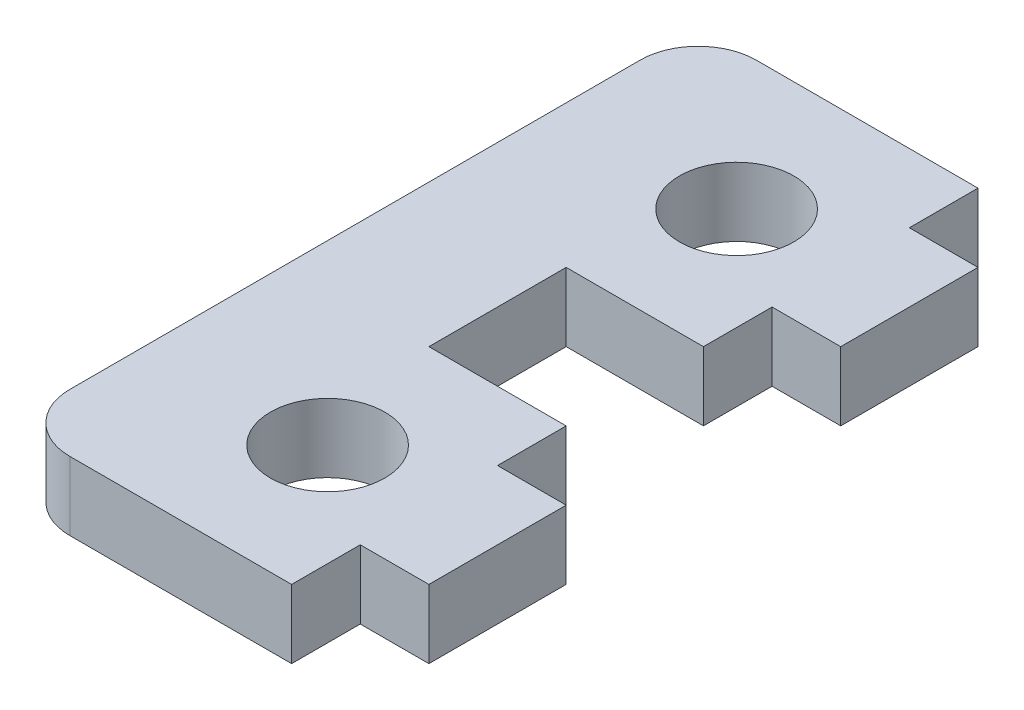
ISO-10303-21;
HEADER;
FILE_DESCRIPTION(('STEP AP214'),'2;1');
FILE_NAME('part.step','',(''),(''),'','','');
FILE_SCHEMA(('AUTOMOTIVE_DESIGN { 1 0 10303 214 1 1 1 1 }'));
ENDSEC;
DATA;
#1=APPLICATION_CONTEXT('core data for automotive mechanical design processes');
#2=APPLICATION_PROTOCOL_DEFINITION('international standard','automotive_design',2000,#1);
#3=PRODUCT_CONTEXT('',#1,'mechanical');
#4=PRODUCT('Part','Part','',(#3));
#5=PRODUCT_RELATED_PRODUCT_CATEGORY('part','',(#4));
#6=PRODUCT_DEFINITION_FORMATION('','',#4);
#7=PRODUCT_DEFINITION_CONTEXT('part definition',#1,'design');
#8=PRODUCT_DEFINITION('design','',#6,#7);
#9=PRODUCT_DEFINITION_SHAPE('','',#8);
#10=(LENGTH_UNIT() NAMED_UNIT(*) SI_UNIT(.MILLI.,.METRE.));
#11=(NAMED_UNIT(*) PLANE_ANGLE_UNIT() SI_UNIT($,.RADIAN.));
#12=(NAMED_UNIT(*) SI_UNIT($,.STERADIAN.) SOLID_ANGLE_UNIT());
#13=UNCERTAINTY_MEASURE_WITH_UNIT(LENGTH_MEASURE(1.E-05),#10,'distance_accuracy_value','');
#14=(GEOMETRIC_REPRESENTATION_CONTEXT(3) GLOBAL_UNCERTAINTY_ASSIGNED_CONTEXT((#13)) GLOBAL_UNIT_ASSIGNED_CONTEXT((#10,
#11,#12)) REPRESENTATION_CONTEXT('',''));
#15=CARTESIAN_POINT('',(0.,0.,0.));
#16=DIRECTION('',(0.,0.,1.));
#17=DIRECTION('',(1.,0.,0.));
#18=AXIS2_PLACEMENT_3D('',#15,#16,#17);
#19=CARTESIAN_POINT('',(-16.0467223141423,6.,30.92));
#20=DIRECTION('',(0.,-1.,0.));
#21=DIRECTION('',(0.,0.,-1.));
#22=AXIS2_PLACEMENT_3D('',#19,#20,#21);
#23=PLANE('',#22);
#24=CARTESIAN_POINT('',(-5.64372266443236,6.,-11.877299035422));
#25=DIRECTION('',(0.,1.,0.));
#26=DIRECTION('',(0.,0.,1.));
#27=AXIS2_PLACEMENT_3D('',#24,#25,#26);
#28=CIRCLE('',#27,5.);
#29=CARTESIAN_POINT('',(-5.64372266443236,6.,-6.87729903542202));
#30=VERTEX_POINT('',#29);
#31=EDGE_CURVE('E196',#30,#30,#28,.T.);
#32=ORIENTED_EDGE('',*,*,#31,.F.);
#33=EDGE_LOOP('',(#32));
#34=FACE_BOUND('',#33,.T.);
#35=DIRECTION('',(-1.,0.,0.));
#36=VECTOR('',#35,1.);
#37=CARTESIAN_POINT('',(-8.66777698518342,6.,12.));
#38=LINE('',#37,#36);
#39=CARTESIAN_POINT('',(3.33222301481658,6.,12.));
#40=VERTEX_POINT('',#39);
#41=CARTESIAN_POINT('',(-8.66777698518342,6.,12.));
#42=VERTEX_POINT('',#41);
#43=EDGE_CURVE('E227',#40,#42,#38,.T.);
#44=ORIENTED_EDGE('',*,*,#43,.T.);
#45=DIRECTION('',(0.,0.,-1.));
#46=VECTOR('',#45,1.);
#47=CARTESIAN_POINT('',(-8.66777698518343,6.,0.));
#48=LINE('',#47,#46);
#49=CARTESIAN_POINT('',(-8.66777698518343,6.,0.));
#50=VERTEX_POINT('',#49);
#51=EDGE_CURVE('E125',#42,#50,#48,.T.);
#52=ORIENTED_EDGE('',*,*,#51,.T.);
#53=DIRECTION('',(1.,0.,0.));
#54=VECTOR('',#53,1.);
#55=CARTESIAN_POINT('',(3.33222301481657,6.,0.));
#56=LINE('',#55,#54);
#57=CARTESIAN_POINT('',(3.33222301481657,6.,0.));
#58=VERTEX_POINT('',#57);
#59=EDGE_CURVE('E272',#50,#58,#56,.T.);
#60=ORIENTED_EDGE('',*,*,#59,.T.);
#61=DIRECTION('',(0.,0.,-1.));
#62=VECTOR('',#61,1.);
#63=CARTESIAN_POINT('',(3.33222301481657,6.,-6.00000000000007));
#64=LINE('',#63,#62);
#65=CARTESIAN_POINT('',(3.33222301481657,6.,-6.00000000000007));
#66=VERTEX_POINT('',#65);
#67=EDGE_CURVE('E291',#58,#66,#64,.T.);
#68=ORIENTED_EDGE('',*,*,#67,.T.);
#69=DIRECTION('',(1.,0.,0.));
#70=VECTOR('',#69,1.);
#71=CARTESIAN_POINT('',(9.33222301481657,6.,-6.00000000000008));
#72=LINE('',#71,#70);
#73=CARTESIAN_POINT('',(9.33222301481657,6.,-6.00000000000008));
#74=VERTEX_POINT('',#73);
#75=EDGE_CURVE('E288',#66,#74,#72,.T.);
#76=ORIENTED_EDGE('',*,*,#75,.T.);
#77=DIRECTION('',(0.,0.,-1.));
#78=VECTOR('',#77,1.);
#79=CARTESIAN_POINT('',(9.33222301481657,6.,-18.0000000000001));
#80=LINE('',#79,#78);
#81=CARTESIAN_POINT('',(9.33222301481657,6.,-18.0000000000001));
#82=VERTEX_POINT('',#81);
#83=EDGE_CURVE('E290',#74,#82,#80,.T.);
#84=ORIENTED_EDGE('',*,*,#83,.T.);
#85=DIRECTION('',(-1.,0.,0.));
#86=VECTOR('',#85,1.);
#87=CARTESIAN_POINT('',(3.33222301481658,6.,-18.));
#88=LINE('',#87,#86);
#89=CARTESIAN_POINT('',(3.33222301481658,6.,-18.));
#90=VERTEX_POINT('',#89);
#91=EDGE_CURVE('E293',#82,#90,#88,.T.);
#92=ORIENTED_EDGE('',*,*,#91,.T.);
#93=DIRECTION('',(0.,0.,-1.));
#94=VECTOR('',#93,1.);
#95=CARTESIAN_POINT('',(3.33222301481658,6.,-24.));
#96=LINE('',#95,#94);
#97=CARTESIAN_POINT('',(3.33222301481658,6.,-24.));
#98=VERTEX_POINT('',#97);
#99=EDGE_CURVE('E299',#90,#98,#96,.T.);
#100=ORIENTED_EDGE('',*,*,#99,.T.);
#101=DIRECTION('',(-1.,0.,0.));
#102=VECTOR('',#101,1.);
#103=CARTESIAN_POINT('',(-16.0467223141423,6.,-23.9999999999999));
#104=LINE('',#103,#102);
#105=CARTESIAN_POINT('',(-16.0467223141423,6.,-23.9999999999999));
#106=VERTEX_POINT('',#105);
#107=EDGE_CURVE('E301',#98,#106,#104,.T.);
#108=ORIENTED_EDGE('',*,*,#107,.T.);
#109=CARTESIAN_POINT('',(-16.0467223141423,6.,-18.9199999999999));
#110=DIRECTION('',(0.,1.,0.));
#111=DIRECTION('',(0.,0.,-1.));
#112=AXIS2_PLACEMENT_3D('',#109,#110,#111);
#113=CIRCLE('',#112,5.08);
#114=CARTESIAN_POINT('',(-21.1267223141423,6.,-18.9199999999999));
#115=VERTEX_POINT('',#114);
#116=EDGE_CURVE('E303',#106,#115,#113,.T.);
#117=ORIENTED_EDGE('',*,*,#116,.T.);
#118=DIRECTION('',(0.,0.,1.));
#119=VECTOR('',#118,1.);
#120=CARTESIAN_POINT('',(-21.1267223141423,6.,-18.9199999999999));
#121=LINE('',#120,#119);
#122=CARTESIAN_POINT('',(-21.1267223141423,6.,30.92));
#123=VERTEX_POINT('',#122);
#124=EDGE_CURVE('E305',#115,#123,#121,.T.);
#125=ORIENTED_EDGE('',*,*,#124,.T.);
#126=CARTESIAN_POINT('',(-16.0467223141423,6.,30.92));
#127=DIRECTION('',(0.,1.,0.));
#128=DIRECTION('',(0.,0.,-1.));
#129=AXIS2_PLACEMENT_3D('',#126,#127,#128);
#130=CIRCLE('',#129,5.08);
#131=CARTESIAN_POINT('',(-16.0467223141423,6.,36.));
#132=VERTEX_POINT('',#131);
#133=EDGE_CURVE('E307',#123,#132,#130,.T.);
#134=ORIENTED_EDGE('',*,*,#133,.T.);
#135=DIRECTION('',(1.,0.,0.));
#136=VECTOR('',#135,1.);
#137=CARTESIAN_POINT('',(3.33222301481658,6.,36.));
#138=LINE('',#137,#136);
#139=CARTESIAN_POINT('',(3.33222301481658,6.,36.));
#140=VERTEX_POINT('',#139);
#141=EDGE_CURVE('E309',#132,#140,#138,.T.);
#142=ORIENTED_EDGE('',*,*,#141,.T.);
#143=DIRECTION('',(0.,0.,-1.));
#144=VECTOR('',#143,1.);
#145=CARTESIAN_POINT('',(3.33222301481658,6.,30.0000000000001));
#146=LINE('',#145,#144);
#147=CARTESIAN_POINT('',(3.33222301481658,6.,30.0000000000001));
#148=VERTEX_POINT('',#147);
#149=EDGE_CURVE('E311',#140,#148,#146,.T.);
#150=ORIENTED_EDGE('',*,*,#149,.T.);
#151=DIRECTION('',(1.,0.,0.));
#152=VECTOR('',#151,1.);
#153=CARTESIAN_POINT('',(9.33222301481658,6.,30.0000000000001));
#154=LINE('',#153,#152);
#155=CARTESIAN_POINT('',(9.33222301481658,6.,30.0000000000001));
#156=VERTEX_POINT('',#155);
#157=EDGE_CURVE('E174',#148,#156,#154,.T.);
#158=ORIENTED_EDGE('',*,*,#157,.T.);
#159=DIRECTION('',(0.,0.,-1.));
#160=VECTOR('',#159,1.);
#161=CARTESIAN_POINT('',(9.33222301481658,6.,18.0000000000001));
#162=LINE('',#161,#160);
#163=CARTESIAN_POINT('',(9.33222301481658,6.,18.0000000000001));
#164=VERTEX_POINT('',#163);
#165=EDGE_CURVE('E168',#156,#164,#162,.T.);
#166=ORIENTED_EDGE('',*,*,#165,.T.);
#167=DIRECTION('',(-1.,0.,0.));
#168=VECTOR('',#167,1.);
#169=CARTESIAN_POINT('',(3.33222301481658,6.,18.0000000000001));
#170=LINE('',#169,#168);
#171=CARTESIAN_POINT('',(3.33222301481658,6.,18.0000000000001));
#172=VERTEX_POINT('',#171);
#173=EDGE_CURVE('E172',#164,#172,#170,.T.);
#174=ORIENTED_EDGE('',*,*,#173,.T.);
#175=DIRECTION('',(0.,0.,-1.));
#176=VECTOR('',#175,1.);
#177=CARTESIAN_POINT('',(3.33222301481658,6.,12.));
#178=LINE('',#177,#176);
#179=EDGE_CURVE('E52',#172,#40,#178,.T.);
#180=ORIENTED_EDGE('',*,*,#179,.T.);
#181=EDGE_LOOP('',(#44,#52,#60,#68,#76,#84,#92,#100,#108,#117,#125,#134,#142,#150,#158,#166,
#174,#180));
#182=FACE_BOUND('',#181,.T.);
#183=CARTESIAN_POINT('',(-5.64372266443236,6.,23.8772990354221));
#184=DIRECTION('',(0.,1.,0.));
#185=DIRECTION('',(0.,0.,1.));
#186=AXIS2_PLACEMENT_3D('',#183,#184,#185);
#187=CIRCLE('',#186,4.99999999999792);
#188=CARTESIAN_POINT('',(-5.64372266443236,6.,28.87729903542));
#189=VERTEX_POINT('',#188);
#190=EDGE_CURVE('E354',#189,#189,#187,.T.);
#191=ORIENTED_EDGE('',*,*,#190,.F.);
#192=EDGE_LOOP('',(#191));
#193=FACE_BOUND('',#192,.T.);
#194=ADVANCED_FACE('F35',(#34,#182,#193),#23,.F.);
#195=CARTESIAN_POINT('',(-16.0467223141423,0.,30.92));
#196=DIRECTION('',(0.,-1.,0.));
#197=DIRECTION('',(0.,0.,-1.));
#198=AXIS2_PLACEMENT_3D('',#195,#196,#197);
#199=PLANE('',#198);
#200=CARTESIAN_POINT('',(-5.64372266443236,0.,-11.877299035422));
#201=DIRECTION('',(0.,1.,0.));
#202=DIRECTION('',(0.,0.,1.));
#203=AXIS2_PLACEMENT_3D('',#200,#201,#202);
#204=CIRCLE('',#203,5.);
#205=CARTESIAN_POINT('',(-5.64372266443236,0.,-6.87729903542202));
#206=VERTEX_POINT('',#205);
#207=EDGE_CURVE('E359',#206,#206,#204,.T.);
#208=ORIENTED_EDGE('',*,*,#207,.T.);
#209=EDGE_LOOP('',(#208));
#210=FACE_BOUND('',#209,.T.);
#211=DIRECTION('',(-1.,0.,0.));
#212=VECTOR('',#211,1.);
#213=CARTESIAN_POINT('',(-8.66777698518342,0.,12.));
#214=LINE('',#213,#212);
#215=CARTESIAN_POINT('',(3.33222301481658,0.,12.));
#216=VERTEX_POINT('',#215);
#217=CARTESIAN_POINT('',(-8.66777698518342,0.,12.));
#218=VERTEX_POINT('',#217);
#219=EDGE_CURVE('E192',#216,#218,#214,.T.);
#220=ORIENTED_EDGE('',*,*,#219,.F.);
#221=DIRECTION('',(0.,0.,-1.));
#222=VECTOR('',#221,1.);
#223=CARTESIAN_POINT('',(3.33222301481658,0.,12.));
#224=LINE('',#223,#222);
#225=CARTESIAN_POINT('',(3.33222301481658,0.,18.0000000000001));
#226=VERTEX_POINT('',#225);
#227=EDGE_CURVE('E117',#226,#216,#224,.T.);
#228=ORIENTED_EDGE('',*,*,#227,.F.);
#229=DIRECTION('',(-1.,0.,0.));
#230=VECTOR('',#229,1.);
#231=CARTESIAN_POINT('',(3.33222301481658,0.,18.0000000000001));
#232=LINE('',#231,#230);
#233=CARTESIAN_POINT('',(9.33222301481658,0.,18.0000000000001));
#234=VERTEX_POINT('',#233);
#235=EDGE_CURVE('E111',#234,#226,#232,.T.);
#236=ORIENTED_EDGE('',*,*,#235,.F.);
#237=DIRECTION('',(0.,0.,-1.));
#238=VECTOR('',#237,1.);
#239=CARTESIAN_POINT('',(9.33222301481658,0.,18.0000000000001));
#240=LINE('',#239,#238);
#241=CARTESIAN_POINT('',(9.33222301481658,0.,30.0000000000001));
#242=VERTEX_POINT('',#241);
#243=EDGE_CURVE('E182',#242,#234,#240,.T.);
#244=ORIENTED_EDGE('',*,*,#243,.F.);
#245=DIRECTION('',(1.,0.,0.));
#246=VECTOR('',#245,1.);
#247=CARTESIAN_POINT('',(9.33222301481658,0.,30.0000000000001));
#248=LINE('',#247,#246);
#249=CARTESIAN_POINT('',(3.33222301481658,0.,30.0000000000001));
#250=VERTEX_POINT('',#249);
#251=EDGE_CURVE('E222',#250,#242,#248,.T.);
#252=ORIENTED_EDGE('',*,*,#251,.F.);
#253=DIRECTION('',(0.,0.,-1.));
#254=VECTOR('',#253,1.);
#255=CARTESIAN_POINT('',(3.33222301481658,0.,30.0000000000001));
#256=LINE('',#255,#254);
#257=CARTESIAN_POINT('',(3.33222301481658,0.,36.));
#258=VERTEX_POINT('',#257);
#259=EDGE_CURVE('E220',#258,#250,#256,.T.);
#260=ORIENTED_EDGE('',*,*,#259,.F.);
#261=DIRECTION('',(1.,0.,0.));
#262=VECTOR('',#261,1.);
#263=CARTESIAN_POINT('',(3.33222301481658,0.,36.));
#264=LINE('',#263,#262);
#265=CARTESIAN_POINT('',(-16.0467223141423,0.,36.));
#266=VERTEX_POINT('',#265);
#267=EDGE_CURVE('E218',#266,#258,#264,.T.);
#268=ORIENTED_EDGE('',*,*,#267,.F.);
#269=CARTESIAN_POINT('',(-16.0467223141423,0.,30.92));
#270=DIRECTION('',(0.,1.,0.));
#271=DIRECTION('',(0.,0.,-1.));
#272=AXIS2_PLACEMENT_3D('',#269,#270,#271);
#273=CIRCLE('',#272,5.08);
#274=CARTESIAN_POINT('',(-21.1267223141423,0.,30.92));
#275=VERTEX_POINT('',#274);
#276=EDGE_CURVE('E216',#275,#266,#273,.T.);
#277=ORIENTED_EDGE('',*,*,#276,.F.);
#278=DIRECTION('',(0.,0.,1.));
#279=VECTOR('',#278,1.);
#280=CARTESIAN_POINT('',(-21.1267223141423,0.,-18.9199999999999));
#281=LINE('',#280,#279);
#282=CARTESIAN_POINT('',(-21.1267223141423,0.,-18.9199999999999));
#283=VERTEX_POINT('',#282);
#284=EDGE_CURVE('E214',#283,#275,#281,.T.);
#285=ORIENTED_EDGE('',*,*,#284,.F.);
#286=CARTESIAN_POINT('',(-16.0467223141423,0.,-18.9199999999999));
#287=DIRECTION('',(0.,1.,0.));
#288=DIRECTION('',(0.,0.,-1.));
#289=AXIS2_PLACEMENT_3D('',#286,#287,#288);
#290=CIRCLE('',#289,5.08);
#291=CARTESIAN_POINT('',(-16.0467223141423,0.,-23.9999999999999));
#292=VERTEX_POINT('',#291);
#293=EDGE_CURVE('E212',#292,#283,#290,.T.);
#294=ORIENTED_EDGE('',*,*,#293,.F.);
#295=DIRECTION('',(-1.,0.,0.));
#296=VECTOR('',#295,1.);
#297=CARTESIAN_POINT('',(-16.0467223141423,0.,-23.9999999999999));
#298=LINE('',#297,#296);
#299=CARTESIAN_POINT('',(3.33222301481658,0.,-24.));
#300=VERTEX_POINT('',#299);
#301=EDGE_CURVE('E210',#300,#292,#298,.T.);
#302=ORIENTED_EDGE('',*,*,#301,.F.);
#303=DIRECTION('',(0.,0.,-1.));
#304=VECTOR('',#303,1.);
#305=CARTESIAN_POINT('',(3.33222301481658,0.,-24.));
#306=LINE('',#305,#304);
#307=CARTESIAN_POINT('',(3.33222301481658,0.,-18.));
#308=VERTEX_POINT('',#307);
#309=EDGE_CURVE('E208',#308,#300,#306,.T.);
#310=ORIENTED_EDGE('',*,*,#309,.F.);
#311=DIRECTION('',(-1.,0.,0.));
#312=VECTOR('',#311,1.);
#313=CARTESIAN_POINT('',(3.33222301481658,0.,-18.));
#314=LINE('',#313,#312);
#315=CARTESIAN_POINT('',(9.33222301481657,0.,-18.0000000000001));
#316=VERTEX_POINT('',#315);
#317=EDGE_CURVE('E206',#316,#308,#314,.T.);
#318=ORIENTED_EDGE('',*,*,#317,.F.);
#319=DIRECTION('',(0.,0.,-1.));
#320=VECTOR('',#319,1.);
#321=CARTESIAN_POINT('',(9.33222301481657,0.,-18.0000000000001));
#322=LINE('',#321,#320);
#323=CARTESIAN_POINT('',(9.33222301481657,0.,-6.00000000000008));
#324=VERTEX_POINT('',#323);
#325=EDGE_CURVE('E204',#324,#316,#322,.T.);
#326=ORIENTED_EDGE('',*,*,#325,.F.);
#327=DIRECTION('',(1.,0.,0.));
#328=VECTOR('',#327,1.);
#329=CARTESIAN_POINT('',(9.33222301481657,0.,-6.00000000000008));
#330=LINE('',#329,#328);
#331=CARTESIAN_POINT('',(3.33222301481657,0.,-6.00000000000007));
#332=VERTEX_POINT('',#331);
#333=EDGE_CURVE('E202',#332,#324,#330,.T.);
#334=ORIENTED_EDGE('',*,*,#333,.F.);
#335=DIRECTION('',(0.,0.,-1.));
#336=VECTOR('',#335,1.);
#337=CARTESIAN_POINT('',(3.33222301481657,0.,-6.00000000000007));
#338=LINE('',#337,#336);
#339=CARTESIAN_POINT('',(3.33222301481657,0.,0.));
#340=VERTEX_POINT('',#339);
#341=EDGE_CURVE('E200',#340,#332,#338,.T.);
#342=ORIENTED_EDGE('',*,*,#341,.F.);
#343=DIRECTION('',(1.,0.,0.));
#344=VECTOR('',#343,1.);
#345=CARTESIAN_POINT('',(3.33222301481657,0.,0.));
#346=LINE('',#345,#344);
#347=CARTESIAN_POINT('',(-8.66777698518343,0.,0.));
#348=VERTEX_POINT('',#347);
#349=EDGE_CURVE('E198',#348,#340,#346,.T.);
#350=ORIENTED_EDGE('',*,*,#349,.F.);
#351=DIRECTION('',(0.,0.,-1.));
#352=VECTOR('',#351,1.);
#353=CARTESIAN_POINT('',(-8.66777698518343,0.,0.));
#354=LINE('',#353,#352);
#355=EDGE_CURVE('E195',#218,#348,#354,.T.);
#356=ORIENTED_EDGE('',*,*,#355,.F.);
#357=EDGE_LOOP('',(#220,#228,#236,#244,#252,#260,#268,#277,#285,#294,#302,#310,#318,#326,#334,
#342,#350,#356));
#358=FACE_BOUND('',#357,.T.);
#359=CARTESIAN_POINT('',(-5.64372266443236,0.,23.8772990354221));
#360=DIRECTION('',(0.,1.,0.));
#361=DIRECTION('',(0.,0.,1.));
#362=AXIS2_PLACEMENT_3D('',#359,#360,#361);
#363=CIRCLE('',#362,4.99999999999792);
#364=CARTESIAN_POINT('',(-5.64372266443236,0.,28.87729903542));
#365=VERTEX_POINT('',#364);
#366=EDGE_CURVE('E357',#365,#365,#363,.T.);
#367=ORIENTED_EDGE('',*,*,#366,.T.);
#368=EDGE_LOOP('',(#367));
#369=FACE_BOUND('',#368,.T.);
#370=ADVANCED_FACE('F276',(#210,#358,#369),#199,.T.);
#371=CARTESIAN_POINT('',(-8.66777698518342,6.,12.));
#372=DIRECTION('',(0.,0.,1.));
#373=DIRECTION('',(1.,0.,0.));
#374=AXIS2_PLACEMENT_3D('',#371,#372,#373);
#375=PLANE('',#374);
#376=ORIENTED_EDGE('',*,*,#219,.T.);
#377=DIRECTION('',(0.,-1.,0.));
#378=VECTOR('',#377,1.);
#379=CARTESIAN_POINT('',(-8.66777698518342,6.,12.));
#380=LINE('',#379,#378);
#381=EDGE_CURVE('E11',#42,#218,#380,.T.);
#382=ORIENTED_EDGE('',*,*,#381,.F.);
#383=ORIENTED_EDGE('',*,*,#43,.F.);
#384=DIRECTION('',(0.,-1.,0.));
#385=VECTOR('',#384,1.);
#386=CARTESIAN_POINT('',(3.33222301481658,6.,12.));
#387=LINE('',#386,#385);
#388=EDGE_CURVE('E188',#40,#216,#387,.T.);
#389=ORIENTED_EDGE('',*,*,#388,.T.);
#390=EDGE_LOOP('',(#376,#382,#383,#389));
#391=FACE_BOUND('',#390,.T.);
#392=ADVANCED_FACE('F37',(#391),#375,.F.);
#393=CARTESIAN_POINT('',(-8.66777698518343,6.,0.));
#394=DIRECTION('',(-1.,0.,0.));
#395=DIRECTION('',(0.,0.,1.));
#396=AXIS2_PLACEMENT_3D('',#393,#394,#395);
#397=PLANE('',#396);
#398=ORIENTED_EDGE('',*,*,#355,.T.);
#399=DIRECTION('',(0.,-1.,0.));
#400=VECTOR('',#399,1.);
#401=CARTESIAN_POINT('',(-8.66777698518343,6.,0.));
#402=LINE('',#401,#400);
#403=EDGE_CURVE('E44',#50,#348,#402,.T.);
#404=ORIENTED_EDGE('',*,*,#403,.F.);
#405=ORIENTED_EDGE('',*,*,#51,.F.);
#406=ORIENTED_EDGE('',*,*,#381,.T.);
#407=EDGE_LOOP('',(#398,#404,#405,#406));
#408=FACE_BOUND('',#407,.T.);
#409=ADVANCED_FACE('F512',(#408),#397,.F.);
#410=CARTESIAN_POINT('',(3.33222301481657,6.,0.));
#411=DIRECTION('',(0.,0.,-1.));
#412=DIRECTION('',(-1.,0.,0.));
#413=AXIS2_PLACEMENT_3D('',#410,#411,#412);
#414=PLANE('',#413);
#415=ORIENTED_EDGE('',*,*,#349,.T.);
#416=DIRECTION('',(0.,-1.,0.));
#417=VECTOR('',#416,1.);
#418=CARTESIAN_POINT('',(3.33222301481657,6.,0.));
#419=LINE('',#418,#417);
#420=EDGE_CURVE('E264',#58,#340,#419,.T.);
#421=ORIENTED_EDGE('',*,*,#420,.F.);
#422=ORIENTED_EDGE('',*,*,#59,.F.);
#423=ORIENTED_EDGE('',*,*,#403,.T.);
#424=EDGE_LOOP('',(#415,#421,#422,#423));
#425=FACE_BOUND('',#424,.T.);
#426=ADVANCED_FACE('F270',(#425),#414,.F.);
#427=CARTESIAN_POINT('',(3.33222301481657,6.,-6.00000000000007));
#428=DIRECTION('',(-1.,0.,0.));
#429=DIRECTION('',(0.,0.,1.));
#430=AXIS2_PLACEMENT_3D('',#427,#428,#429);
#431=PLANE('',#430);
#432=ORIENTED_EDGE('',*,*,#341,.T.);
#433=DIRECTION('',(0.,-1.,0.));
#434=VECTOR('',#433,1.);
#435=CARTESIAN_POINT('',(3.33222301481657,6.,-6.00000000000007));
#436=LINE('',#435,#434);
#437=EDGE_CURVE('E261',#66,#332,#436,.T.);
#438=ORIENTED_EDGE('',*,*,#437,.F.);
#439=ORIENTED_EDGE('',*,*,#67,.F.);
#440=ORIENTED_EDGE('',*,*,#420,.T.);
#441=EDGE_LOOP('',(#432,#438,#439,#440));
#442=FACE_BOUND('',#441,.T.);
#443=ADVANCED_FACE('F282',(#442),#431,.F.);
#444=CARTESIAN_POINT('',(9.33222301481657,6.,-6.00000000000008));
#445=DIRECTION('',(0.,0.,-1.));
#446=DIRECTION('',(-1.,0.,0.));
#447=AXIS2_PLACEMENT_3D('',#444,#445,#446);
#448=PLANE('',#447);
#449=ORIENTED_EDGE('',*,*,#333,.T.);
#450=DIRECTION('',(0.,-1.,0.));
#451=VECTOR('',#450,1.);
#452=CARTESIAN_POINT('',(9.33222301481657,6.,-6.00000000000008));
#453=LINE('',#452,#451);
#454=EDGE_CURVE('E258',#74,#324,#453,.T.);
#455=ORIENTED_EDGE('',*,*,#454,.F.);
#456=ORIENTED_EDGE('',*,*,#75,.F.);
#457=ORIENTED_EDGE('',*,*,#437,.T.);
#458=EDGE_LOOP('',(#449,#455,#456,#457));
#459=FACE_BOUND('',#458,.T.);
#460=ADVANCED_FACE('F286',(#459),#448,.F.);
#461=CARTESIAN_POINT('',(9.33222301481657,6.,-18.0000000000001));
#462=DIRECTION('',(-1.,0.,0.));
#463=DIRECTION('',(0.,0.,1.));
#464=AXIS2_PLACEMENT_3D('',#461,#462,#463);
#465=PLANE('',#464);
#466=ORIENTED_EDGE('',*,*,#325,.T.);
#467=DIRECTION('',(0.,-1.,0.));
#468=VECTOR('',#467,1.);
#469=CARTESIAN_POINT('',(9.33222301481657,6.,-18.0000000000001));
#470=LINE('',#469,#468);
#471=EDGE_CURVE('E255',#82,#316,#470,.T.);
#472=ORIENTED_EDGE('',*,*,#471,.F.);
#473=ORIENTED_EDGE('',*,*,#83,.F.);
#474=ORIENTED_EDGE('',*,*,#454,.T.);
#475=EDGE_LOOP('',(#466,#472,#473,#474));
#476=FACE_BOUND('',#475,.T.);
#477=ADVANCED_FACE('F477',(#476),#465,.F.);
#478=CARTESIAN_POINT('',(3.33222301481658,6.,-18.));
#479=DIRECTION('',(0.,0.,1.));
#480=DIRECTION('',(1.,0.,0.));
#481=AXIS2_PLACEMENT_3D('',#478,#479,#480);
#482=PLANE('',#481);
#483=ORIENTED_EDGE('',*,*,#317,.T.);
#484=DIRECTION('',(0.,-1.,0.));
#485=VECTOR('',#484,1.);
#486=CARTESIAN_POINT('',(3.33222301481658,6.,-18.));
#487=LINE('',#486,#485);
#488=EDGE_CURVE('E252',#90,#308,#487,.T.);
#489=ORIENTED_EDGE('',*,*,#488,.F.);
#490=ORIENTED_EDGE('',*,*,#91,.F.);
#491=ORIENTED_EDGE('',*,*,#471,.T.);
#492=EDGE_LOOP('',(#483,#489,#490,#491));
#493=FACE_BOUND('',#492,.T.);
#494=ADVANCED_FACE('F467',(#493),#482,.F.);
#495=CARTESIAN_POINT('',(3.33222301481658,6.,-24.));
#496=DIRECTION('',(-1.,0.,0.));
#497=DIRECTION('',(0.,0.,1.));
#498=AXIS2_PLACEMENT_3D('',#495,#496,#497);
#499=PLANE('',#498);
#500=ORIENTED_EDGE('',*,*,#309,.T.);
#501=DIRECTION('',(0.,-1.,0.));
#502=VECTOR('',#501,1.);
#503=CARTESIAN_POINT('',(3.33222301481658,6.,-24.));
#504=LINE('',#503,#502);
#505=EDGE_CURVE('E249',#98,#300,#504,.T.);
#506=ORIENTED_EDGE('',*,*,#505,.F.);
#507=ORIENTED_EDGE('',*,*,#99,.F.);
#508=ORIENTED_EDGE('',*,*,#488,.T.);
#509=EDGE_LOOP('',(#500,#506,#507,#508));
#510=FACE_BOUND('',#509,.T.);
#511=ADVANCED_FACE('F457',(#510),#499,.F.);
#512=CARTESIAN_POINT('',(-16.0467223141423,6.,-23.9999999999999));
#513=DIRECTION('',(0.,0.,1.));
#514=DIRECTION('',(1.,0.,0.));
#515=AXIS2_PLACEMENT_3D('',#512,#513,#514);
#516=PLANE('',#515);
#517=ORIENTED_EDGE('',*,*,#301,.T.);
#518=DIRECTION('',(0.,-1.,0.));
#519=VECTOR('',#518,1.);
#520=CARTESIAN_POINT('',(-16.0467223141423,6.,-23.9999999999999));
#521=LINE('',#520,#519);
#522=EDGE_CURVE('E246',#106,#292,#521,.T.);
#523=ORIENTED_EDGE('',*,*,#522,.F.);
#524=ORIENTED_EDGE('',*,*,#107,.F.);
#525=ORIENTED_EDGE('',*,*,#505,.T.);
#526=EDGE_LOOP('',(#517,#523,#524,#525));
#527=FACE_BOUND('',#526,.T.);
#528=ADVANCED_FACE('F447',(#527),#516,.F.);
#529=CARTESIAN_POINT('',(-16.0467223141423,6.,-18.9199999999999));
#530=DIRECTION('',(0.,-1.,0.));
#531=DIRECTION('',(0.,0.,-1.));
#532=AXIS2_PLACEMENT_3D('',#529,#530,#531);
#533=CYLINDRICAL_SURFACE('',#532,5.08);
#534=ORIENTED_EDGE('',*,*,#293,.T.);
#535=DIRECTION('',(0.,-1.,0.));
#536=VECTOR('',#535,1.);
#537=CARTESIAN_POINT('',(-21.1267223141423,6.,-18.9199999999999));
#538=LINE('',#537,#536);
#539=EDGE_CURVE('E243',#115,#283,#538,.T.);
#540=ORIENTED_EDGE('',*,*,#539,.F.);
#541=ORIENTED_EDGE('',*,*,#116,.F.);
#542=ORIENTED_EDGE('',*,*,#522,.T.);
#543=EDGE_LOOP('',(#534,#540,#541,#542));
#544=FACE_BOUND('',#543,.T.);
#545=ADVANCED_FACE('F437',(#544),#533,.T.);
#546=CARTESIAN_POINT('',(-21.1267223141423,6.,-18.9199999999999));
#547=DIRECTION('',(1.,0.,0.));
#548=DIRECTION('',(0.,0.,-1.));
#549=AXIS2_PLACEMENT_3D('',#546,#547,#548);
#550=PLANE('',#549);
#551=ORIENTED_EDGE('',*,*,#284,.T.);
#552=DIRECTION('',(0.,-1.,0.));
#553=VECTOR('',#552,1.);
#554=CARTESIAN_POINT('',(-21.1267223141423,6.,30.92));
#555=LINE('',#554,#553);
#556=EDGE_CURVE('E240',#123,#275,#555,.T.);
#557=ORIENTED_EDGE('',*,*,#556,.F.);
#558=ORIENTED_EDGE('',*,*,#124,.F.);
#559=ORIENTED_EDGE('',*,*,#539,.T.);
#560=EDGE_LOOP('',(#551,#557,#558,#559));
#561=FACE_BOUND('',#560,.T.);
#562=ADVANCED_FACE('F427',(#561),#550,.F.);
#563=CARTESIAN_POINT('',(-16.0467223141423,6.,30.92));
#564=DIRECTION('',(0.,-1.,0.));
#565=DIRECTION('',(0.,0.,-1.));
#566=AXIS2_PLACEMENT_3D('',#563,#564,#565);
#567=CYLINDRICAL_SURFACE('',#566,5.08);
#568=ORIENTED_EDGE('',*,*,#276,.T.);
#569=DIRECTION('',(0.,-1.,0.));
#570=VECTOR('',#569,1.);
#571=CARTESIAN_POINT('',(-16.0467223141423,6.,36.));
#572=LINE('',#571,#570);
#573=EDGE_CURVE('E237',#132,#266,#572,.T.);
#574=ORIENTED_EDGE('',*,*,#573,.F.);
#575=ORIENTED_EDGE('',*,*,#133,.F.);
#576=ORIENTED_EDGE('',*,*,#556,.T.);
#577=EDGE_LOOP('',(#568,#574,#575,#576));
#578=FACE_BOUND('',#577,.T.);
#579=ADVANCED_FACE('F417',(#578),#567,.T.);
#580=CARTESIAN_POINT('',(3.33222301481658,6.,36.));
#581=DIRECTION('',(0.,0.,-1.));
#582=DIRECTION('',(-1.,0.,0.));
#583=AXIS2_PLACEMENT_3D('',#580,#581,#582);
#584=PLANE('',#583);
#585=ORIENTED_EDGE('',*,*,#267,.T.);
#586=DIRECTION('',(0.,-1.,0.));
#587=VECTOR('',#586,1.);
#588=CARTESIAN_POINT('',(3.33222301481658,6.,36.));
#589=LINE('',#588,#587);
#590=EDGE_CURVE('E234',#140,#258,#589,.T.);
#591=ORIENTED_EDGE('',*,*,#590,.F.);
#592=ORIENTED_EDGE('',*,*,#141,.F.);
#593=ORIENTED_EDGE('',*,*,#573,.T.);
#594=EDGE_LOOP('',(#585,#591,#592,#593));
#595=FACE_BOUND('',#594,.T.);
#596=ADVANCED_FACE('F408',(#595),#584,.F.);
#597=CARTESIAN_POINT('',(3.33222301481658,6.,30.0000000000001));
#598=DIRECTION('',(-1.,0.,0.));
#599=DIRECTION('',(0.,0.,1.));
#600=AXIS2_PLACEMENT_3D('',#597,#598,#599);
#601=PLANE('',#600);
#602=ORIENTED_EDGE('',*,*,#259,.T.);
#603=DIRECTION('',(0.,-1.,0.));
#604=VECTOR('',#603,1.);
#605=CARTESIAN_POINT('',(3.33222301481658,6.,30.0000000000001));
#606=LINE('',#605,#604);
#607=EDGE_CURVE('E231',#148,#250,#606,.T.);
#608=ORIENTED_EDGE('',*,*,#607,.F.);
#609=ORIENTED_EDGE('',*,*,#149,.F.);
#610=ORIENTED_EDGE('',*,*,#590,.T.);
#611=EDGE_LOOP('',(#602,#608,#609,#610));
#612=FACE_BOUND('',#611,.T.);
#613=ADVANCED_FACE('F317',(#612),#601,.F.);
#614=CARTESIAN_POINT('',(9.33222301481658,6.,30.0000000000001));
#615=DIRECTION('',(0.,0.,-1.));
#616=DIRECTION('',(-1.,0.,0.));
#617=AXIS2_PLACEMENT_3D('',#614,#615,#616);
#618=PLANE('',#617);
#619=ORIENTED_EDGE('',*,*,#251,.T.);
#620=DIRECTION('',(0.,-1.,0.));
#621=VECTOR('',#620,1.);
#622=CARTESIAN_POINT('',(9.33222301481658,6.,30.0000000000001));
#623=LINE('',#622,#621);
#624=EDGE_CURVE('E183',#156,#242,#623,.T.);
#625=ORIENTED_EDGE('',*,*,#624,.F.);
#626=ORIENTED_EDGE('',*,*,#157,.F.);
#627=ORIENTED_EDGE('',*,*,#607,.T.);
#628=EDGE_LOOP('',(#619,#625,#626,#627));
#629=FACE_BOUND('',#628,.T.);
#630=ADVANCED_FACE('F321',(#629),#618,.F.);
#631=CARTESIAN_POINT('',(9.33222301481658,6.,18.0000000000001));
#632=DIRECTION('',(-1.,0.,0.));
#633=DIRECTION('',(0.,0.,1.));
#634=AXIS2_PLACEMENT_3D('',#631,#632,#633);
#635=PLANE('',#634);
#636=ORIENTED_EDGE('',*,*,#243,.T.);
#637=DIRECTION('',(0.,-1.,0.));
#638=VECTOR('',#637,1.);
#639=CARTESIAN_POINT('',(9.33222301481658,6.,18.0000000000001));
#640=LINE('',#639,#638);
#641=EDGE_CURVE('E179',#164,#234,#640,.T.);
#642=ORIENTED_EDGE('',*,*,#641,.F.);
#643=ORIENTED_EDGE('',*,*,#165,.F.);
#644=ORIENTED_EDGE('',*,*,#624,.T.);
#645=EDGE_LOOP('',(#636,#642,#643,#644));
#646=FACE_BOUND('',#645,.T.);
#647=ADVANCED_FACE('F180',(#646),#635,.F.);
#648=CARTESIAN_POINT('',(3.33222301481658,6.,18.0000000000001));
#649=DIRECTION('',(0.,0.,1.));
#650=DIRECTION('',(1.,0.,0.));
#651=AXIS2_PLACEMENT_3D('',#648,#649,#650);
#652=PLANE('',#651);
#653=ORIENTED_EDGE('',*,*,#235,.T.);
#654=DIRECTION('',(0.,-1.,0.));
#655=VECTOR('',#654,1.);
#656=CARTESIAN_POINT('',(3.33222301481658,6.,18.0000000000001));
#657=LINE('',#656,#655);
#658=EDGE_CURVE('E184',#172,#226,#657,.T.);
#659=ORIENTED_EDGE('',*,*,#658,.F.);
#660=ORIENTED_EDGE('',*,*,#173,.F.);
#661=ORIENTED_EDGE('',*,*,#641,.T.);
#662=EDGE_LOOP('',(#653,#659,#660,#661));
#663=FACE_BOUND('',#662,.T.);
#664=ADVANCED_FACE('F186',(#663),#652,.F.);
#665=CARTESIAN_POINT('',(3.33222301481658,6.,12.));
#666=DIRECTION('',(-1.,0.,0.));
#667=DIRECTION('',(0.,0.,1.));
#668=AXIS2_PLACEMENT_3D('',#665,#666,#667);
#669=PLANE('',#668);
#670=ORIENTED_EDGE('',*,*,#227,.T.);
#671=ORIENTED_EDGE('',*,*,#388,.F.);
#672=ORIENTED_EDGE('',*,*,#179,.F.);
#673=ORIENTED_EDGE('',*,*,#658,.T.);
#674=EDGE_LOOP('',(#670,#671,#672,#673));
#675=FACE_BOUND('',#674,.T.);
#676=ADVANCED_FACE('F325',(#675),#669,.F.);
#677=CARTESIAN_POINT('',(-5.64372266443236,6.,-11.877299035422));
#678=DIRECTION('',(0.,-1.,0.));
#679=DIRECTION('',(0.,0.,-1.));
#680=AXIS2_PLACEMENT_3D('',#677,#678,#679);
#681=CYLINDRICAL_SURFACE('',#680,5.);
#682=ORIENTED_EDGE('',*,*,#31,.T.);
#683=EDGE_LOOP('',(#682));
#684=FACE_BOUND('',#683,.T.);
#685=ORIENTED_EDGE('',*,*,#207,.F.);
#686=EDGE_LOOP('',(#685));
#687=FACE_BOUND('',#686,.T.);
#688=ADVANCED_FACE('F327',(#684,#687),#681,.F.);
#689=CARTESIAN_POINT('',(-5.64372266443236,6.,23.8772990354221));
#690=DIRECTION('',(0.,-1.,0.));
#691=DIRECTION('',(0.,0.,-1.));
#692=AXIS2_PLACEMENT_3D('',#689,#690,#691);
#693=CYLINDRICAL_SURFACE('',#692,4.99999999999792);
#694=ORIENTED_EDGE('',*,*,#190,.T.);
#695=EDGE_LOOP('',(#694));
#696=FACE_BOUND('',#695,.T.);
#697=ORIENTED_EDGE('',*,*,#366,.F.);
#698=EDGE_LOOP('',(#697));
#699=FACE_BOUND('',#698,.T.);
#700=ADVANCED_FACE('F333',(#696,#699),#693,.F.);
#701=CLOSED_SHELL('',(#194,#370,#392,#409,#426,#443,#460,#477,#494,#511,#528,#545,#562,#579,
#596,#613,#630,#647,#664,#676,#688,#700));
#702=MANIFOLD_SOLID_BREP('B2',#701);
#703=ADVANCED_BREP_SHAPE_REPRESENTATION('',(#18,#702),#14);
#704=SHAPE_DEFINITION_REPRESENTATION(#9,#703);
ENDSEC;
END-ISO-10303-21;
